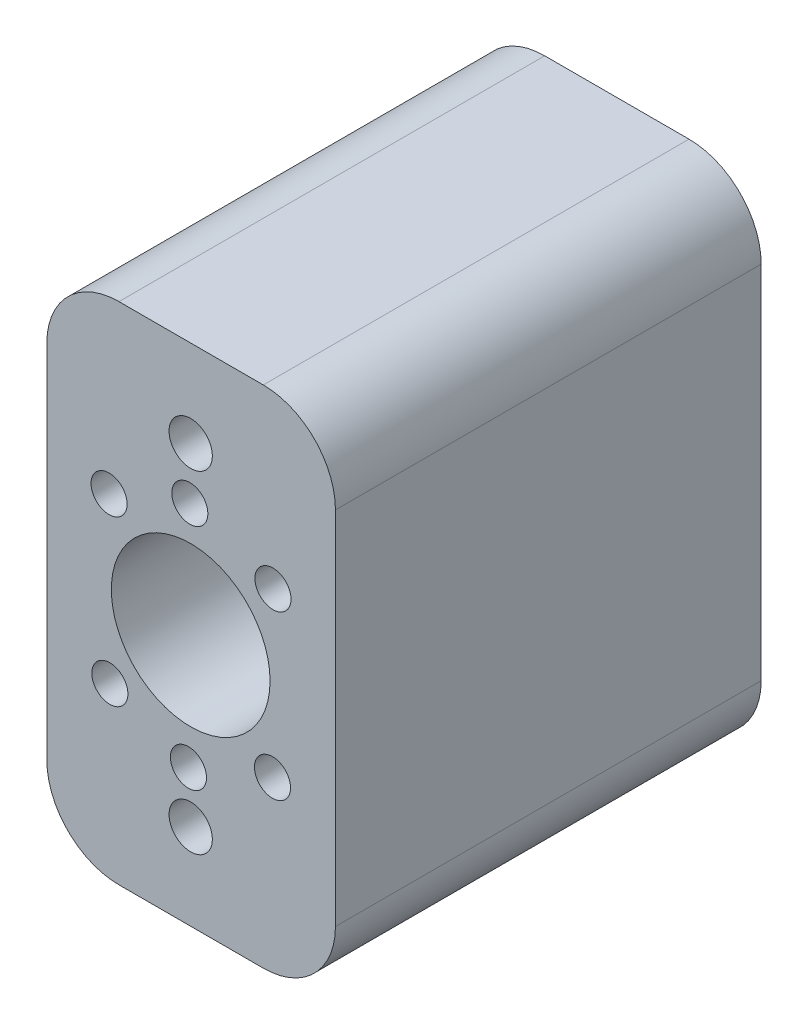
ISO-10303-21;
HEADER;
FILE_DESCRIPTION(('STEP AP214'),'2;1');
FILE_NAME('part.step','',(''),(''),'','','');
FILE_SCHEMA(('AUTOMOTIVE_DESIGN { 1 0 10303 214 1 1 1 1 }'));
ENDSEC;
DATA;
#1=APPLICATION_CONTEXT('core data for automotive mechanical design processes');
#2=APPLICATION_PROTOCOL_DEFINITION('international standard','automotive_design',2000,#1);
#3=PRODUCT_CONTEXT('',#1,'mechanical');
#4=PRODUCT('Part','Part','',(#3));
#5=PRODUCT_RELATED_PRODUCT_CATEGORY('part','',(#4));
#6=PRODUCT_DEFINITION_FORMATION('','',#4);
#7=PRODUCT_DEFINITION_CONTEXT('part definition',#1,'design');
#8=PRODUCT_DEFINITION('design','',#6,#7);
#9=PRODUCT_DEFINITION_SHAPE('','',#8);
#10=(LENGTH_UNIT() NAMED_UNIT(*) SI_UNIT(.MILLI.,.METRE.));
#11=(NAMED_UNIT(*) PLANE_ANGLE_UNIT() SI_UNIT($,.RADIAN.));
#12=(NAMED_UNIT(*) SI_UNIT($,.STERADIAN.) SOLID_ANGLE_UNIT());
#13=UNCERTAINTY_MEASURE_WITH_UNIT(LENGTH_MEASURE(1.E-05),#10,'distance_accuracy_value','');
#14=(GEOMETRIC_REPRESENTATION_CONTEXT(3) GLOBAL_UNCERTAINTY_ASSIGNED_CONTEXT((#13)) GLOBAL_UNIT_ASSIGNED_CONTEXT((#10,
#11,#12)) REPRESENTATION_CONTEXT('',''));
#15=CARTESIAN_POINT('',(0.,0.,0.));
#16=DIRECTION('',(0.,0.,1.));
#17=DIRECTION('',(1.,0.,0.));
#18=AXIS2_PLACEMENT_3D('',#15,#16,#17);
#19=CARTESIAN_POINT('',(-9.93916934376417,-24.937205351954,59.));
#20=DIRECTION('',(0.,0.,1.));
#21=DIRECTION('',(1.,0.,0.));
#22=AXIS2_PLACEMENT_3D('',#19,#20,#21);
#23=CYLINDRICAL_SURFACE('',#22,10.);
#24=DIRECTION('',(0.,0.,1.));
#25=VECTOR('',#24,1.);
#26=CARTESIAN_POINT('',(-19.9391693437642,-24.937205351954,59.));
#27=LINE('',#26,#25);
#28=CARTESIAN_POINT('',(-19.9391693437642,-24.937205351954,0.));
#29=VERTEX_POINT('',#28);
#30=CARTESIAN_POINT('',(-19.9391693437642,-24.937205351954,59.));
#31=VERTEX_POINT('',#30);
#32=EDGE_CURVE('E303',#29,#31,#27,.T.);
#33=ORIENTED_EDGE('',*,*,#32,.F.);
#34=CARTESIAN_POINT('',(-9.93916934376417,-24.937205351954,0.));
#35=DIRECTION('',(0.,0.,1.));
#36=DIRECTION('',(1.,0.,0.));
#37=AXIS2_PLACEMENT_3D('',#34,#35,#36);
#38=CIRCLE('',#37,10.);
#39=CARTESIAN_POINT('',(-9.93916934376417,-34.937205351954,0.));
#40=VERTEX_POINT('',#39);
#41=EDGE_CURVE('E51',#40,#29,#38,.F.);
#42=ORIENTED_EDGE('',*,*,#41,.F.);
#43=DIRECTION('',(0.,0.,1.));
#44=VECTOR('',#43,1.);
#45=CARTESIAN_POINT('',(-9.93916934376417,-34.937205351954,59.));
#46=LINE('',#45,#44);
#47=CARTESIAN_POINT('',(-9.93916934376417,-34.937205351954,59.));
#48=VERTEX_POINT('',#47);
#49=EDGE_CURVE('E306',#48,#40,#46,.F.);
#50=ORIENTED_EDGE('',*,*,#49,.F.);
#51=CARTESIAN_POINT('',(-9.93916934376417,-24.937205351954,59.));
#52=DIRECTION('',(0.,0.,1.));
#53=DIRECTION('',(1.,0.,0.));
#54=AXIS2_PLACEMENT_3D('',#51,#52,#53);
#55=CIRCLE('',#54,10.);
#56=EDGE_CURVE('E11',#31,#48,#55,.T.);
#57=ORIENTED_EDGE('',*,*,#56,.F.);
#58=EDGE_LOOP('',(#33,#42,#50,#57));
#59=FACE_BOUND('',#58,.T.);
#60=ADVANCED_FACE('F44',(#59),#23,.T.);
#61=CARTESIAN_POINT('',(10.0608306562358,-24.937205351954,59.));
#62=DIRECTION('',(0.,0.,1.));
#63=DIRECTION('',(1.,0.,0.));
#64=AXIS2_PLACEMENT_3D('',#61,#62,#63);
#65=CYLINDRICAL_SURFACE('',#64,10.);
#66=DIRECTION('',(0.,0.,-1.));
#67=VECTOR('',#66,1.);
#68=CARTESIAN_POINT('',(20.0608306562358,-24.937205351954,59.));
#69=LINE('',#68,#67);
#70=CARTESIAN_POINT('',(20.0608306562358,-24.937205351954,59.));
#71=VERTEX_POINT('',#70);
#72=CARTESIAN_POINT('',(20.0608306562358,-24.937205351954,0.));
#73=VERTEX_POINT('',#72);
#74=EDGE_CURVE('E292',#71,#73,#69,.T.);
#75=ORIENTED_EDGE('',*,*,#74,.F.);
#76=CARTESIAN_POINT('',(10.0608306562358,-24.937205351954,59.));
#77=DIRECTION('',(0.,0.,1.));
#78=DIRECTION('',(1.,0.,0.));
#79=AXIS2_PLACEMENT_3D('',#76,#77,#78);
#80=CIRCLE('',#79,10.);
#81=CARTESIAN_POINT('',(10.0608306562358,-34.937205351954,59.));
#82=VERTEX_POINT('',#81);
#83=EDGE_CURVE('E298',#82,#71,#80,.T.);
#84=ORIENTED_EDGE('',*,*,#83,.F.);
#85=DIRECTION('',(0.,0.,-1.));
#86=VECTOR('',#85,1.);
#87=CARTESIAN_POINT('',(10.0608306562358,-34.937205351954,59.));
#88=LINE('',#87,#86);
#89=CARTESIAN_POINT('',(10.0608306562358,-34.937205351954,0.));
#90=VERTEX_POINT('',#89);
#91=EDGE_CURVE('E295',#90,#82,#88,.F.);
#92=ORIENTED_EDGE('',*,*,#91,.F.);
#93=CARTESIAN_POINT('',(10.0608306562358,-24.937205351954,0.));
#94=DIRECTION('',(0.,0.,1.));
#95=DIRECTION('',(1.,0.,0.));
#96=AXIS2_PLACEMENT_3D('',#93,#94,#95);
#97=CIRCLE('',#96,10.);
#98=EDGE_CURVE('E300',#73,#90,#97,.F.);
#99=ORIENTED_EDGE('',*,*,#98,.F.);
#100=EDGE_LOOP('',(#75,#84,#92,#99));
#101=FACE_BOUND('',#100,.T.);
#102=ADVANCED_FACE('F336',(#101),#65,.T.);
#103=CARTESIAN_POINT('',(-9.93916934376417,25.062794648046,59.));
#104=DIRECTION('',(0.,0.,1.));
#105=DIRECTION('',(1.,0.,0.));
#106=AXIS2_PLACEMENT_3D('',#103,#104,#105);
#107=CYLINDRICAL_SURFACE('',#106,10.);
#108=DIRECTION('',(0.,0.,-1.));
#109=VECTOR('',#108,1.);
#110=CARTESIAN_POINT('',(-19.9391693437642,25.062794648046,59.));
#111=LINE('',#110,#109);
#112=CARTESIAN_POINT('',(-19.9391693437642,25.0627946480461,59.));
#113=VERTEX_POINT('',#112);
#114=CARTESIAN_POINT('',(-19.9391693437642,25.0627946480461,0.));
#115=VERTEX_POINT('',#114);
#116=EDGE_CURVE('E282',#113,#115,#111,.T.);
#117=ORIENTED_EDGE('',*,*,#116,.F.);
#118=CARTESIAN_POINT('',(-9.93916934376417,25.062794648046,59.));
#119=DIRECTION('',(0.,0.,1.));
#120=DIRECTION('',(1.,0.,0.));
#121=AXIS2_PLACEMENT_3D('',#118,#119,#120);
#122=CIRCLE('',#121,10.);
#123=CARTESIAN_POINT('',(-9.93916934376417,35.0627946480461,59.));
#124=VERTEX_POINT('',#123);
#125=EDGE_CURVE('E288',#124,#113,#122,.T.);
#126=ORIENTED_EDGE('',*,*,#125,.F.);
#127=DIRECTION('',(0.,0.,-1.));
#128=VECTOR('',#127,1.);
#129=CARTESIAN_POINT('',(-9.93916934376417,35.0627946480461,59.));
#130=LINE('',#129,#128);
#131=CARTESIAN_POINT('',(-9.93916934376417,35.0627946480461,0.));
#132=VERTEX_POINT('',#131);
#133=EDGE_CURVE('E285',#132,#124,#130,.F.);
#134=ORIENTED_EDGE('',*,*,#133,.F.);
#135=CARTESIAN_POINT('',(-9.93916934376417,25.062794648046,0.));
#136=DIRECTION('',(0.,0.,1.));
#137=DIRECTION('',(1.,0.,0.));
#138=AXIS2_PLACEMENT_3D('',#135,#136,#137);
#139=CIRCLE('',#138,10.);
#140=EDGE_CURVE('E290',#115,#132,#139,.F.);
#141=ORIENTED_EDGE('',*,*,#140,.F.);
#142=EDGE_LOOP('',(#117,#126,#134,#141));
#143=FACE_BOUND('',#142,.T.);
#144=ADVANCED_FACE('F316',(#143),#107,.T.);
#145=CARTESIAN_POINT('',(10.0608306562358,25.062794648046,59.));
#146=DIRECTION('',(0.,0.,1.));
#147=DIRECTION('',(1.,0.,0.));
#148=AXIS2_PLACEMENT_3D('',#145,#146,#147);
#149=CYLINDRICAL_SURFACE('',#148,10.);
#150=DIRECTION('',(0.,0.,1.));
#151=VECTOR('',#150,1.);
#152=CARTESIAN_POINT('',(20.0608306562358,25.062794648046,59.));
#153=LINE('',#152,#151);
#154=CARTESIAN_POINT('',(20.0608306562358,25.0627946480461,0.));
#155=VERTEX_POINT('',#154);
#156=CARTESIAN_POINT('',(20.0608306562358,25.0627946480461,59.));
#157=VERTEX_POINT('',#156);
#158=EDGE_CURVE('E263',#155,#157,#153,.T.);
#159=ORIENTED_EDGE('',*,*,#158,.F.);
#160=CARTESIAN_POINT('',(10.0608306562358,25.062794648046,0.));
#161=DIRECTION('',(0.,0.,1.));
#162=DIRECTION('',(1.,0.,0.));
#163=AXIS2_PLACEMENT_3D('',#160,#161,#162);
#164=CIRCLE('',#163,10.);
#165=CARTESIAN_POINT('',(10.0608306562358,35.0627946480461,0.));
#166=VERTEX_POINT('',#165);
#167=EDGE_CURVE('E277',#166,#155,#164,.F.);
#168=ORIENTED_EDGE('',*,*,#167,.F.);
#169=DIRECTION('',(0.,0.,1.));
#170=VECTOR('',#169,1.);
#171=CARTESIAN_POINT('',(10.0608306562358,35.0627946480461,59.));
#172=LINE('',#171,#170);
#173=CARTESIAN_POINT('',(10.0608306562358,35.0627946480461,59.));
#174=VERTEX_POINT('',#173);
#175=EDGE_CURVE('E274',#174,#166,#172,.F.);
#176=ORIENTED_EDGE('',*,*,#175,.F.);
#177=CARTESIAN_POINT('',(10.0608306562358,25.062794648046,59.));
#178=DIRECTION('',(0.,0.,1.));
#179=DIRECTION('',(1.,0.,0.));
#180=AXIS2_PLACEMENT_3D('',#177,#178,#179);
#181=CIRCLE('',#180,10.);
#182=EDGE_CURVE('E279',#157,#174,#181,.T.);
#183=ORIENTED_EDGE('',*,*,#182,.F.);
#184=EDGE_LOOP('',(#159,#168,#176,#183));
#185=FACE_BOUND('',#184,.T.);
#186=ADVANCED_FACE('F324',(#185),#149,.T.);
#187=CARTESIAN_POINT('',(-19.9391693437642,35.0627946480461,59.));
#188=DIRECTION('',(1.,0.,0.));
#189=DIRECTION('',(0.,0.,-1.));
#190=AXIS2_PLACEMENT_3D('',#187,#188,#189);
#191=PLANE('',#190);
#192=DIRECTION('',(0.,0.,1.));
#193=VECTOR('',#192,1.);
#194=CARTESIAN_POINT('',(-19.9391693437642,-17.9372053519539,17.5));
#195=LINE('',#194,#193);
#196=CARTESIAN_POINT('',(-19.9391693437642,-17.9372053519539,17.5));
#197=VERTEX_POINT('',#196);
#198=CARTESIAN_POINT('',(-19.9391693437642,-17.9372053519539,41.5));
#199=VERTEX_POINT('',#198);
#200=EDGE_CURVE('E176',#197,#199,#195,.T.);
#201=ORIENTED_EDGE('',*,*,#200,.F.);
#202=DIRECTION('',(0.,-1.,0.));
#203=VECTOR('',#202,1.);
#204=CARTESIAN_POINT('',(-19.9391693437642,-11.9372053519539,17.5));
#205=LINE('',#204,#203);
#206=CARTESIAN_POINT('',(-19.9391693437642,-11.9372053519539,17.5));
#207=VERTEX_POINT('',#206);
#208=EDGE_CURVE('E147',#207,#197,#205,.T.);
#209=ORIENTED_EDGE('',*,*,#208,.F.);
#210=DIRECTION('',(0.,0.,1.));
#211=VECTOR('',#210,1.);
#212=CARTESIAN_POINT('',(-19.9391693437642,-11.9372053519539,17.5));
#213=LINE('',#212,#211);
#214=CARTESIAN_POINT('',(-19.9391693437642,-11.9372053519539,41.5));
#215=VERTEX_POINT('',#214);
#216=EDGE_CURVE('E164',#207,#215,#213,.T.);
#217=ORIENTED_EDGE('',*,*,#216,.T.);
#218=DIRECTION('',(0.,-1.,0.));
#219=VECTOR('',#218,1.);
#220=CARTESIAN_POINT('',(-19.9391693437642,-11.9372053519539,41.5));
#221=LINE('',#220,#219);
#222=EDGE_CURVE('E167',#215,#199,#221,.T.);
#223=ORIENTED_EDGE('',*,*,#222,.T.);
#224=EDGE_LOOP('',(#201,#209,#217,#223));
#225=FACE_BOUND('',#224,.T.);
#226=CARTESIAN_POINT('',(-19.9391693437642,15.0627946480461,14.5));
#227=DIRECTION('',(-1.,0.,0.));
#228=DIRECTION('',(0.,0.,1.));
#229=AXIS2_PLACEMENT_3D('',#226,#227,#228);
#230=CIRCLE('',#229,1.25);
#231=CARTESIAN_POINT('',(-19.9391693437642,15.0627946480461,15.75));
#232=VERTEX_POINT('',#231);
#233=EDGE_CURVE('E183',#232,#232,#230,.T.);
#234=ORIENTED_EDGE('',*,*,#233,.F.);
#235=EDGE_LOOP('',(#234));
#236=FACE_BOUND('',#235,.T.);
#237=CARTESIAN_POINT('',(-19.9391693437642,15.0627946480461,44.5));
#238=DIRECTION('',(-1.,0.,0.));
#239=DIRECTION('',(0.,0.,1.));
#240=AXIS2_PLACEMENT_3D('',#237,#238,#239);
#241=CIRCLE('',#240,1.25);
#242=CARTESIAN_POINT('',(-19.9391693437642,15.0627946480461,45.75));
#243=VERTEX_POINT('',#242);
#244=EDGE_CURVE('E192',#243,#243,#241,.T.);
#245=ORIENTED_EDGE('',*,*,#244,.F.);
#246=EDGE_LOOP('',(#245));
#247=FACE_BOUND('',#246,.T.);
#248=CARTESIAN_POINT('',(-19.9391693437642,-14.9372053519539,44.5));
#249=DIRECTION('',(-1.,0.,0.));
#250=DIRECTION('',(0.,0.,1.));
#251=AXIS2_PLACEMENT_3D('',#248,#249,#250);
#252=CIRCLE('',#251,1.25);
#253=CARTESIAN_POINT('',(-19.9391693437642,-14.9372053519539,45.75));
#254=VERTEX_POINT('',#253);
#255=EDGE_CURVE('E198',#254,#254,#252,.T.);
#256=ORIENTED_EDGE('',*,*,#255,.F.);
#257=EDGE_LOOP('',(#256));
#258=FACE_BOUND('',#257,.T.);
#259=CARTESIAN_POINT('',(-19.9391693437642,-14.9372053519539,14.5));
#260=DIRECTION('',(-1.,0.,0.));
#261=DIRECTION('',(0.,0.,1.));
#262=AXIS2_PLACEMENT_3D('',#259,#260,#261);
#263=CIRCLE('',#262,1.25);
#264=CARTESIAN_POINT('',(-19.9391693437642,-14.9372053519539,15.75));
#265=VERTEX_POINT('',#264);
#266=EDGE_CURVE('E204',#265,#265,#263,.T.);
#267=ORIENTED_EDGE('',*,*,#266,.F.);
#268=EDGE_LOOP('',(#267));
#269=FACE_BOUND('',#268,.T.);
#270=DIRECTION('',(0.,-1.,0.));
#271=VECTOR('',#270,1.);
#272=CARTESIAN_POINT('',(-19.9391693437642,35.0627946480461,0.));
#273=LINE('',#272,#271);
#274=EDGE_CURVE('E250',#115,#29,#273,.T.);
#275=ORIENTED_EDGE('',*,*,#274,.T.);
#276=ORIENTED_EDGE('',*,*,#32,.T.);
#277=DIRECTION('',(0.,-1.,0.));
#278=VECTOR('',#277,1.);
#279=CARTESIAN_POINT('',(-19.9391693437642,35.0627946480461,59.));
#280=LINE('',#279,#278);
#281=EDGE_CURVE('E253',#113,#31,#280,.T.);
#282=ORIENTED_EDGE('',*,*,#281,.F.);
#283=ORIENTED_EDGE('',*,*,#116,.T.);
#284=EDGE_LOOP('',(#275,#276,#282,#283));
#285=FACE_BOUND('',#284,.T.);
#286=ADVANCED_FACE('F313',(#225,#236,#247,#258,#269,#285),#191,.F.);
#287=CARTESIAN_POINT('',(-19.9391693437642,-34.937205351954,59.));
#288=DIRECTION('',(0.,1.,0.));
#289=DIRECTION('',(0.,0.,1.));
#290=AXIS2_PLACEMENT_3D('',#287,#288,#289);
#291=PLANE('',#290);
#292=DIRECTION('',(1.,0.,0.));
#293=VECTOR('',#292,1.);
#294=CARTESIAN_POINT('',(-19.9391693437642,-34.937205351954,59.));
#295=LINE('',#294,#293);
#296=EDGE_CURVE('E255',#48,#82,#295,.T.);
#297=ORIENTED_EDGE('',*,*,#296,.F.);
#298=ORIENTED_EDGE('',*,*,#49,.T.);
#299=DIRECTION('',(1.,0.,0.));
#300=VECTOR('',#299,1.);
#301=CARTESIAN_POINT('',(-19.9391693437642,-34.937205351954,0.));
#302=LINE('',#301,#300);
#303=EDGE_CURVE('E266',#40,#90,#302,.T.);
#304=ORIENTED_EDGE('',*,*,#303,.T.);
#305=ORIENTED_EDGE('',*,*,#91,.T.);
#306=EDGE_LOOP('',(#297,#298,#304,#305));
#307=FACE_BOUND('',#306,.T.);
#308=ADVANCED_FACE('F339',(#307),#291,.F.);
#309=CARTESIAN_POINT('',(20.0608306562358,35.0627946480461,59.));
#310=DIRECTION('',(1.,0.,0.));
#311=DIRECTION('',(0.,0.,-1.));
#312=AXIS2_PLACEMENT_3D('',#309,#310,#311);
#313=PLANE('',#312);
#314=DIRECTION('',(0.,-1.,0.));
#315=VECTOR('',#314,1.);
#316=CARTESIAN_POINT('',(20.0608306562358,35.0627946480461,59.));
#317=LINE('',#316,#315);
#318=EDGE_CURVE('E258',#157,#71,#317,.T.);
#319=ORIENTED_EDGE('',*,*,#318,.T.);
#320=ORIENTED_EDGE('',*,*,#74,.T.);
#321=DIRECTION('',(0.,-1.,0.));
#322=VECTOR('',#321,1.);
#323=CARTESIAN_POINT('',(20.0608306562358,35.0627946480461,0.));
#324=LINE('',#323,#322);
#325=EDGE_CURVE('E268',#155,#73,#324,.T.);
#326=ORIENTED_EDGE('',*,*,#325,.F.);
#327=ORIENTED_EDGE('',*,*,#158,.T.);
#328=EDGE_LOOP('',(#319,#320,#326,#327));
#329=FACE_BOUND('',#328,.T.);
#330=ADVANCED_FACE('F331',(#329),#313,.T.);
#331=CARTESIAN_POINT('',(-19.9391693437642,35.0627946480461,59.));
#332=DIRECTION('',(0.,1.,0.));
#333=DIRECTION('',(0.,0.,1.));
#334=AXIS2_PLACEMENT_3D('',#331,#332,#333);
#335=PLANE('',#334);
#336=DIRECTION('',(1.,0.,0.));
#337=VECTOR('',#336,1.);
#338=CARTESIAN_POINT('',(-19.9391693437642,35.0627946480461,0.));
#339=LINE('',#338,#337);
#340=EDGE_CURVE('E256',#132,#166,#339,.T.);
#341=ORIENTED_EDGE('',*,*,#340,.F.);
#342=ORIENTED_EDGE('',*,*,#133,.T.);
#343=DIRECTION('',(1.,0.,0.));
#344=VECTOR('',#343,1.);
#345=CARTESIAN_POINT('',(-19.9391693437642,35.0627946480461,59.));
#346=LINE('',#345,#344);
#347=EDGE_CURVE('E261',#124,#174,#346,.T.);
#348=ORIENTED_EDGE('',*,*,#347,.T.);
#349=ORIENTED_EDGE('',*,*,#175,.T.);
#350=EDGE_LOOP('',(#341,#342,#348,#349));
#351=FACE_BOUND('',#350,.T.);
#352=ADVANCED_FACE('F326',(#351),#335,.T.);
#353=CARTESIAN_POINT('',(0.,0.,59.));
#354=DIRECTION('',(0.,0.,1.));
#355=DIRECTION('',(1.,0.,0.));
#356=AXIS2_PLACEMENT_3D('',#353,#354,#355);
#357=PLANE('',#356);
#358=CARTESIAN_POINT('',(0.,23.01,59.));
#359=DIRECTION('',(0.,0.,1.));
#360=DIRECTION('',(1.,0.,0.));
#361=AXIS2_PLACEMENT_3D('',#358,#359,#360);
#362=CIRCLE('',#361,3.);
#363=CARTESIAN_POINT('',(3.,23.01,59.));
#364=VERTEX_POINT('',#363);
#365=EDGE_CURVE('E762',#364,#364,#362,.T.);
#366=ORIENTED_EDGE('',*,*,#365,.F.);
#367=EDGE_LOOP('',(#366));
#368=FACE_BOUND('',#367,.T.);
#369=CARTESIAN_POINT('',(0.,-23.01,59.));
#370=DIRECTION('',(0.,0.,1.));
#371=DIRECTION('',(1.,0.,0.));
#372=AXIS2_PLACEMENT_3D('',#369,#370,#371);
#373=CIRCLE('',#372,3.);
#374=CARTESIAN_POINT('',(3.,-23.01,59.));
#375=VERTEX_POINT('',#374);
#376=EDGE_CURVE('E763',#375,#375,#373,.T.);
#377=ORIENTED_EDGE('',*,*,#376,.F.);
#378=EDGE_LOOP('',(#377));
#379=FACE_BOUND('',#378,.T.);
#380=CARTESIAN_POINT('',(-11.3137084989847,11.3137084989848,59.));
#381=DIRECTION('',(0.,0.,1.));
#382=DIRECTION('',(1.,0.,0.));
#383=AXIS2_PLACEMENT_3D('',#380,#381,#382);
#384=CIRCLE('',#383,2.5);
#385=CARTESIAN_POINT('',(-8.8137084989847,11.3137084989848,59.));
#386=VERTEX_POINT('',#385);
#387=EDGE_CURVE('E227',#386,#386,#384,.T.);
#388=ORIENTED_EDGE('',*,*,#387,.F.);
#389=EDGE_LOOP('',(#388));
#390=FACE_BOUND('',#389,.T.);
#391=CARTESIAN_POINT('',(-0.122338903727766,15.7597255865445,59.));
#392=DIRECTION('',(0.,0.,1.));
#393=DIRECTION('',(1.,0.,0.));
#394=AXIS2_PLACEMENT_3D('',#391,#392,#393);
#395=CIRCLE('',#394,2.5);
#396=CARTESIAN_POINT('',(2.37766109627223,15.7597255865445,59.));
#397=VERTEX_POINT('',#396);
#398=EDGE_CURVE('E233',#397,#397,#395,.T.);
#399=ORIENTED_EDGE('',*,*,#398,.F.);
#400=EDGE_LOOP('',(#399));
#401=FACE_BOUND('',#400,.T.);
#402=CARTESIAN_POINT('',(11.4026934424135,11.2636964844784,59.));
#403=DIRECTION('',(0.,0.,1.));
#404=DIRECTION('',(1.,0.,0.));
#405=AXIS2_PLACEMENT_3D('',#402,#403,#404);
#406=CIRCLE('',#405,2.5);
#407=CARTESIAN_POINT('',(13.9026934424135,11.2636964844784,59.));
#408=VERTEX_POINT('',#407);
#409=EDGE_CURVE('E239',#408,#408,#406,.T.);
#410=ORIENTED_EDGE('',*,*,#409,.F.);
#411=EDGE_LOOP('',(#410));
#412=FACE_BOUND('',#411,.T.);
#413=CARTESIAN_POINT('',(11.3393690888633,-11.4064220865028,59.));
#414=DIRECTION('',(0.,0.,1.));
#415=DIRECTION('',(1.,0.,0.));
#416=AXIS2_PLACEMENT_3D('',#413,#414,#415);
#417=CIRCLE('',#416,2.5);
#418=CARTESIAN_POINT('',(13.8393690888633,-11.4064220865028,59.));
#419=VERTEX_POINT('',#418);
#420=EDGE_CURVE('E214',#419,#419,#417,.T.);
#421=ORIENTED_EDGE('',*,*,#420,.F.);
#422=EDGE_LOOP('',(#421));
#423=FACE_BOUND('',#422,.T.);
#424=CARTESIAN_POINT('',(-0.312311964378448,-16.0290998956694,59.));
#425=DIRECTION('',(0.,0.,1.));
#426=DIRECTION('',(1.,0.,0.));
#427=AXIS2_PLACEMENT_3D('',#424,#425,#426);
#428=CIRCLE('',#427,2.5);
#429=CARTESIAN_POINT('',(2.18768803562155,-16.0290998956694,59.));
#430=VERTEX_POINT('',#429);
#431=EDGE_CURVE('E215',#430,#430,#428,.T.);
#432=ORIENTED_EDGE('',*,*,#431,.F.);
#433=EDGE_LOOP('',(#432));
#434=FACE_BOUND('',#433,.T.);
#435=CARTESIAN_POINT('',(-11.2041007750175,-11.4064220865028,59.));
#436=DIRECTION('',(0.,0.,1.));
#437=DIRECTION('',(1.,0.,0.));
#438=AXIS2_PLACEMENT_3D('',#435,#436,#437);
#439=CIRCLE('',#438,2.5);
#440=CARTESIAN_POINT('',(-8.70410077501747,-11.4064220865028,59.));
#441=VERTEX_POINT('',#440);
#442=EDGE_CURVE('E210',#441,#441,#439,.T.);
#443=ORIENTED_EDGE('',*,*,#442,.F.);
#444=EDGE_LOOP('',(#443));
#445=FACE_BOUND('',#444,.T.);
#446=CARTESIAN_POINT('',(0.,0.,59.));
#447=DIRECTION('',(0.,0.,1.));
#448=DIRECTION('',(1.,0.,0.));
#449=AXIS2_PLACEMENT_3D('',#446,#447,#448);
#450=CIRCLE('',#449,11.);
#451=CARTESIAN_POINT('',(11.,0.,59.));
#452=VERTEX_POINT('',#451);
#453=EDGE_CURVE('E247',#452,#452,#450,.T.);
#454=ORIENTED_EDGE('',*,*,#453,.F.);
#455=EDGE_LOOP('',(#454));
#456=FACE_BOUND('',#455,.T.);
#457=ORIENTED_EDGE('',*,*,#281,.T.);
#458=ORIENTED_EDGE('',*,*,#56,.T.);
#459=ORIENTED_EDGE('',*,*,#296,.T.);
#460=ORIENTED_EDGE('',*,*,#83,.T.);
#461=ORIENTED_EDGE('',*,*,#318,.F.);
#462=ORIENTED_EDGE('',*,*,#182,.T.);
#463=ORIENTED_EDGE('',*,*,#347,.F.);
#464=ORIENTED_EDGE('',*,*,#125,.T.);
#465=EDGE_LOOP('',(#457,#458,#459,#460,#461,#462,#463,#464));
#466=FACE_BOUND('',#465,.T.);
#467=ADVANCED_FACE('F329',(#368,#379,#390,#401,#412,#423,#434,#445,#456,#466),#357,.T.);
#468=CARTESIAN_POINT('',(0.,0.,0.));
#469=DIRECTION('',(0.,0.,1.));
#470=DIRECTION('',(1.,0.,0.));
#471=AXIS2_PLACEMENT_3D('',#468,#469,#470);
#472=PLANE('',#471);
#473=CARTESIAN_POINT('',(0.,23.01,0.));
#474=DIRECTION('',(0.,0.,1.));
#475=DIRECTION('',(1.,0.,0.));
#476=AXIS2_PLACEMENT_3D('',#473,#474,#475);
#477=CIRCLE('',#476,3.);
#478=CARTESIAN_POINT('',(3.,23.01,0.));
#479=VERTEX_POINT('',#478);
#480=EDGE_CURVE('E177',#479,#479,#477,.T.);
#481=ORIENTED_EDGE('',*,*,#480,.T.);
#482=EDGE_LOOP('',(#481));
#483=FACE_BOUND('',#482,.T.);
#484=CARTESIAN_POINT('',(0.,-23.01,0.));
#485=DIRECTION('',(0.,0.,1.));
#486=DIRECTION('',(1.,0.,0.));
#487=AXIS2_PLACEMENT_3D('',#484,#485,#486);
#488=CIRCLE('',#487,3.);
#489=CARTESIAN_POINT('',(3.,-23.01,0.));
#490=VERTEX_POINT('',#489);
#491=EDGE_CURVE('E170',#490,#490,#488,.T.);
#492=ORIENTED_EDGE('',*,*,#491,.T.);
#493=EDGE_LOOP('',(#492));
#494=FACE_BOUND('',#493,.T.);
#495=CARTESIAN_POINT('',(-11.3137084989847,11.3137084989848,0.));
#496=DIRECTION('',(0.,0.,1.));
#497=DIRECTION('',(1.,0.,0.));
#498=AXIS2_PLACEMENT_3D('',#495,#496,#497);
#499=CIRCLE('',#498,2.5);
#500=CARTESIAN_POINT('',(-8.8137084989847,11.3137084989848,0.));
#501=VERTEX_POINT('',#500);
#502=EDGE_CURVE('E223',#501,#501,#499,.T.);
#503=ORIENTED_EDGE('',*,*,#502,.T.);
#504=EDGE_LOOP('',(#503));
#505=FACE_BOUND('',#504,.T.);
#506=CARTESIAN_POINT('',(-0.122338903727766,15.7597255865445,0.));
#507=DIRECTION('',(0.,0.,1.));
#508=DIRECTION('',(1.,0.,0.));
#509=AXIS2_PLACEMENT_3D('',#506,#507,#508);
#510=CIRCLE('',#509,2.5);
#511=CARTESIAN_POINT('',(2.37766109627223,15.7597255865445,0.));
#512=VERTEX_POINT('',#511);
#513=EDGE_CURVE('E230',#512,#512,#510,.T.);
#514=ORIENTED_EDGE('',*,*,#513,.T.);
#515=EDGE_LOOP('',(#514));
#516=FACE_BOUND('',#515,.T.);
#517=CARTESIAN_POINT('',(11.4026934424135,11.2636964844784,0.));
#518=DIRECTION('',(0.,0.,1.));
#519=DIRECTION('',(1.,0.,0.));
#520=AXIS2_PLACEMENT_3D('',#517,#518,#519);
#521=CIRCLE('',#520,2.5);
#522=CARTESIAN_POINT('',(13.9026934424135,11.2636964844784,0.));
#523=VERTEX_POINT('',#522);
#524=EDGE_CURVE('E236',#523,#523,#521,.T.);
#525=ORIENTED_EDGE('',*,*,#524,.T.);
#526=EDGE_LOOP('',(#525));
#527=FACE_BOUND('',#526,.T.);
#528=CARTESIAN_POINT('',(11.3393690888633,-11.4064220865028,0.));
#529=DIRECTION('',(0.,0.,1.));
#530=DIRECTION('',(1.,0.,0.));
#531=AXIS2_PLACEMENT_3D('',#528,#529,#530);
#532=CIRCLE('',#531,2.5);
#533=CARTESIAN_POINT('',(13.8393690888633,-11.4064220865028,0.));
#534=VERTEX_POINT('',#533);
#535=EDGE_CURVE('E242',#534,#534,#532,.T.);
#536=ORIENTED_EDGE('',*,*,#535,.T.);
#537=EDGE_LOOP('',(#536));
#538=FACE_BOUND('',#537,.T.);
#539=CARTESIAN_POINT('',(-0.312311964378448,-16.0290998956694,0.));
#540=DIRECTION('',(0.,0.,1.));
#541=DIRECTION('',(1.,0.,0.));
#542=AXIS2_PLACEMENT_3D('',#539,#540,#541);
#543=CIRCLE('',#542,2.5);
#544=CARTESIAN_POINT('',(2.18768803562155,-16.0290998956694,0.));
#545=VERTEX_POINT('',#544);
#546=EDGE_CURVE('E211',#545,#545,#543,.T.);
#547=ORIENTED_EDGE('',*,*,#546,.T.);
#548=EDGE_LOOP('',(#547));
#549=FACE_BOUND('',#548,.T.);
#550=CARTESIAN_POINT('',(-11.2041007750175,-11.4064220865028,0.));
#551=DIRECTION('',(0.,0.,1.));
#552=DIRECTION('',(1.,0.,0.));
#553=AXIS2_PLACEMENT_3D('',#550,#551,#552);
#554=CIRCLE('',#553,2.5);
#555=CARTESIAN_POINT('',(-8.70410077501747,-11.4064220865028,0.));
#556=VERTEX_POINT('',#555);
#557=EDGE_CURVE('E218',#556,#556,#554,.T.);
#558=ORIENTED_EDGE('',*,*,#557,.T.);
#559=EDGE_LOOP('',(#558));
#560=FACE_BOUND('',#559,.T.);
#561=CARTESIAN_POINT('',(0.,0.,0.));
#562=DIRECTION('',(0.,0.,1.));
#563=DIRECTION('',(1.,0.,0.));
#564=AXIS2_PLACEMENT_3D('',#561,#562,#563);
#565=CIRCLE('',#564,11.);
#566=CARTESIAN_POINT('',(11.,0.,0.));
#567=VERTEX_POINT('',#566);
#568=EDGE_CURVE('E226',#567,#567,#565,.T.);
#569=ORIENTED_EDGE('',*,*,#568,.T.);
#570=EDGE_LOOP('',(#569));
#571=FACE_BOUND('',#570,.T.);
#572=ORIENTED_EDGE('',*,*,#303,.F.);
#573=ORIENTED_EDGE('',*,*,#41,.T.);
#574=ORIENTED_EDGE('',*,*,#274,.F.);
#575=ORIENTED_EDGE('',*,*,#140,.T.);
#576=ORIENTED_EDGE('',*,*,#340,.T.);
#577=ORIENTED_EDGE('',*,*,#167,.T.);
#578=ORIENTED_EDGE('',*,*,#325,.T.);
#579=ORIENTED_EDGE('',*,*,#98,.T.);
#580=EDGE_LOOP('',(#572,#573,#574,#575,#576,#577,#578,#579));
#581=FACE_BOUND('',#580,.T.);
#582=ADVANCED_FACE('F310',(#483,#494,#505,#516,#527,#538,#549,#560,#571,#581),#472,.F.);
#583=CARTESIAN_POINT('',(0.,0.,59.));
#584=DIRECTION('',(0.,0.,-1.));
#585=DIRECTION('',(-1.,0.,0.));
#586=AXIS2_PLACEMENT_3D('',#583,#584,#585);
#587=CYLINDRICAL_SURFACE('',#586,11.);
#588=ORIENTED_EDGE('',*,*,#453,.T.);
#589=EDGE_LOOP('',(#588));
#590=FACE_BOUND('',#589,.T.);
#591=ORIENTED_EDGE('',*,*,#568,.F.);
#592=EDGE_LOOP('',(#591));
#593=FACE_BOUND('',#592,.T.);
#594=ADVANCED_FACE('F399',(#590,#593),#587,.F.);
#595=CARTESIAN_POINT('',(-11.2041007750175,-11.4064220865028,59.));
#596=DIRECTION('',(0.,0.,-1.));
#597=DIRECTION('',(-1.,0.,0.));
#598=AXIS2_PLACEMENT_3D('',#595,#596,#597);
#599=CYLINDRICAL_SURFACE('',#598,2.5);
#600=ORIENTED_EDGE('',*,*,#442,.T.);
#601=EDGE_LOOP('',(#600));
#602=FACE_BOUND('',#601,.T.);
#603=ORIENTED_EDGE('',*,*,#557,.F.);
#604=EDGE_LOOP('',(#603));
#605=FACE_BOUND('',#604,.T.);
#606=ADVANCED_FACE('F618',(#602,#605),#599,.F.);
#607=CARTESIAN_POINT('',(-0.312311964378448,-16.0290998956694,59.));
#608=DIRECTION('',(0.,0.,-1.));
#609=DIRECTION('',(-1.,0.,0.));
#610=AXIS2_PLACEMENT_3D('',#607,#608,#609);
#611=CYLINDRICAL_SURFACE('',#610,2.5);
#612=ORIENTED_EDGE('',*,*,#431,.T.);
#613=EDGE_LOOP('',(#612));
#614=FACE_BOUND('',#613,.T.);
#615=ORIENTED_EDGE('',*,*,#546,.F.);
#616=EDGE_LOOP('',(#615));
#617=FACE_BOUND('',#616,.T.);
#618=ADVANCED_FACE('F608',(#614,#617),#611,.F.);
#619=CARTESIAN_POINT('',(11.3393690888633,-11.4064220865028,59.));
#620=DIRECTION('',(0.,0.,-1.));
#621=DIRECTION('',(-1.,0.,0.));
#622=AXIS2_PLACEMENT_3D('',#619,#620,#621);
#623=CYLINDRICAL_SURFACE('',#622,2.5);
#624=ORIENTED_EDGE('',*,*,#420,.T.);
#625=EDGE_LOOP('',(#624));
#626=FACE_BOUND('',#625,.T.);
#627=ORIENTED_EDGE('',*,*,#535,.F.);
#628=EDGE_LOOP('',(#627));
#629=FACE_BOUND('',#628,.T.);
#630=ADVANCED_FACE('F598',(#626,#629),#623,.F.);
#631=CARTESIAN_POINT('',(11.4026934424135,11.2636964844784,59.));
#632=DIRECTION('',(0.,0.,-1.));
#633=DIRECTION('',(-1.,0.,0.));
#634=AXIS2_PLACEMENT_3D('',#631,#632,#633);
#635=CYLINDRICAL_SURFACE('',#634,2.5);
#636=ORIENTED_EDGE('',*,*,#409,.T.);
#637=EDGE_LOOP('',(#636));
#638=FACE_BOUND('',#637,.T.);
#639=ORIENTED_EDGE('',*,*,#524,.F.);
#640=EDGE_LOOP('',(#639));
#641=FACE_BOUND('',#640,.T.);
#642=ADVANCED_FACE('F588',(#638,#641),#635,.F.);
#643=CARTESIAN_POINT('',(-0.122338903727766,15.7597255865445,59.));
#644=DIRECTION('',(0.,0.,-1.));
#645=DIRECTION('',(-1.,0.,0.));
#646=AXIS2_PLACEMENT_3D('',#643,#644,#645);
#647=CYLINDRICAL_SURFACE('',#646,2.5);
#648=ORIENTED_EDGE('',*,*,#398,.T.);
#649=EDGE_LOOP('',(#648));
#650=FACE_BOUND('',#649,.T.);
#651=ORIENTED_EDGE('',*,*,#513,.F.);
#652=EDGE_LOOP('',(#651));
#653=FACE_BOUND('',#652,.T.);
#654=ADVANCED_FACE('F578',(#650,#653),#647,.F.);
#655=CARTESIAN_POINT('',(-11.3137084989847,11.3137084989848,59.));
#656=DIRECTION('',(0.,0.,-1.));
#657=DIRECTION('',(-1.,0.,0.));
#658=AXIS2_PLACEMENT_3D('',#655,#656,#657);
#659=CYLINDRICAL_SURFACE('',#658,2.5);
#660=ORIENTED_EDGE('',*,*,#387,.T.);
#661=EDGE_LOOP('',(#660));
#662=FACE_BOUND('',#661,.T.);
#663=ORIENTED_EDGE('',*,*,#502,.F.);
#664=EDGE_LOOP('',(#663));
#665=FACE_BOUND('',#664,.T.);
#666=ADVANCED_FACE('F568',(#662,#665),#659,.F.);
#667=CARTESIAN_POINT('',(-12.6902451175486,-14.9372053519539,14.5));
#668=DIRECTION('',(-1.,0.,0.));
#669=DIRECTION('',(0.,0.,1.));
#670=AXIS2_PLACEMENT_3D('',#667,#668,#669);
#671=CONICAL_SURFACE('',#670,1.25,1.02974425867665);
#672=CARTESIAN_POINT('',(-11.9391693437642,-14.9372053519539,14.5));
#673=VERTEX_POINT('',#672);
#674=VERTEX_LOOP('',#673);
#675=FACE_BOUND('',#674,.T.);
#676=CARTESIAN_POINT('',(-12.6902451175486,-14.9372053519539,14.5));
#677=DIRECTION('',(-1.,0.,0.));
#678=DIRECTION('',(0.,0.,1.));
#679=AXIS2_PLACEMENT_3D('',#676,#677,#678);
#680=CIRCLE('',#679,1.25);
#681=CARTESIAN_POINT('',(-12.6902451175486,-14.9372053519539,15.75));
#682=VERTEX_POINT('',#681);
#683=EDGE_CURVE('E207',#682,#682,#680,.T.);
#684=ORIENTED_EDGE('',*,*,#683,.T.);
#685=EDGE_LOOP('',(#684));
#686=FACE_BOUND('',#685,.T.);
#687=ADVANCED_FACE('F558',(#675,#686),#671,.F.);
#688=CARTESIAN_POINT('',(-19.9391693437642,-14.9372053519539,14.5));
#689=DIRECTION('',(-1.,0.,0.));
#690=DIRECTION('',(0.,0.,1.));
#691=AXIS2_PLACEMENT_3D('',#688,#689,#690);
#692=CYLINDRICAL_SURFACE('',#691,1.25);
#693=ORIENTED_EDGE('',*,*,#683,.F.);
#694=EDGE_LOOP('',(#693));
#695=FACE_BOUND('',#694,.T.);
#696=ORIENTED_EDGE('',*,*,#266,.T.);
#697=EDGE_LOOP('',(#696));
#698=FACE_BOUND('',#697,.T.);
#699=ADVANCED_FACE('F548',(#695,#698),#692,.F.);
#700=CARTESIAN_POINT('',(-12.6902451175486,-14.9372053519539,44.5));
#701=DIRECTION('',(-1.,0.,0.));
#702=DIRECTION('',(0.,0.,1.));
#703=AXIS2_PLACEMENT_3D('',#700,#701,#702);
#704=CONICAL_SURFACE('',#703,1.25,1.02974425867665);
#705=CARTESIAN_POINT('',(-11.9391693437642,-14.9372053519539,44.5));
#706=VERTEX_POINT('',#705);
#707=VERTEX_LOOP('',#706);
#708=FACE_BOUND('',#707,.T.);
#709=CARTESIAN_POINT('',(-12.6902451175486,-14.9372053519539,44.5));
#710=DIRECTION('',(-1.,0.,0.));
#711=DIRECTION('',(0.,0.,1.));
#712=AXIS2_PLACEMENT_3D('',#709,#710,#711);
#713=CIRCLE('',#712,1.25);
#714=CARTESIAN_POINT('',(-12.6902451175486,-14.9372053519539,45.75));
#715=VERTEX_POINT('',#714);
#716=EDGE_CURVE('E201',#715,#715,#713,.T.);
#717=ORIENTED_EDGE('',*,*,#716,.T.);
#718=EDGE_LOOP('',(#717));
#719=FACE_BOUND('',#718,.T.);
#720=ADVANCED_FACE('F538',(#708,#719),#704,.F.);
#721=CARTESIAN_POINT('',(-19.9391693437642,-14.9372053519539,44.5));
#722=DIRECTION('',(-1.,0.,0.));
#723=DIRECTION('',(0.,0.,1.));
#724=AXIS2_PLACEMENT_3D('',#721,#722,#723);
#725=CYLINDRICAL_SURFACE('',#724,1.25);
#726=ORIENTED_EDGE('',*,*,#716,.F.);
#727=EDGE_LOOP('',(#726));
#728=FACE_BOUND('',#727,.T.);
#729=ORIENTED_EDGE('',*,*,#255,.T.);
#730=EDGE_LOOP('',(#729));
#731=FACE_BOUND('',#730,.T.);
#732=ADVANCED_FACE('F528',(#728,#731),#725,.F.);
#733=CARTESIAN_POINT('',(-12.6902451175486,15.0627946480461,44.5));
#734=DIRECTION('',(-1.,0.,0.));
#735=DIRECTION('',(0.,0.,1.));
#736=AXIS2_PLACEMENT_3D('',#733,#734,#735);
#737=CONICAL_SURFACE('',#736,1.25,1.02974425867665);
#738=CARTESIAN_POINT('',(-11.9391693437642,15.0627946480461,44.5));
#739=VERTEX_POINT('',#738);
#740=VERTEX_LOOP('',#739);
#741=FACE_BOUND('',#740,.T.);
#742=CARTESIAN_POINT('',(-12.6902451175486,15.0627946480461,44.5));
#743=DIRECTION('',(-1.,0.,0.));
#744=DIRECTION('',(0.,0.,1.));
#745=AXIS2_PLACEMENT_3D('',#742,#743,#744);
#746=CIRCLE('',#745,1.25);
#747=CARTESIAN_POINT('',(-12.6902451175486,15.0627946480461,45.75));
#748=VERTEX_POINT('',#747);
#749=EDGE_CURVE('E195',#748,#748,#746,.T.);
#750=ORIENTED_EDGE('',*,*,#749,.T.);
#751=EDGE_LOOP('',(#750));
#752=FACE_BOUND('',#751,.T.);
#753=ADVANCED_FACE('F518',(#741,#752),#737,.F.);
#754=CARTESIAN_POINT('',(-19.9391693437642,15.0627946480461,44.5));
#755=DIRECTION('',(-1.,0.,0.));
#756=DIRECTION('',(0.,0.,1.));
#757=AXIS2_PLACEMENT_3D('',#754,#755,#756);
#758=CYLINDRICAL_SURFACE('',#757,1.25);
#759=ORIENTED_EDGE('',*,*,#749,.F.);
#760=EDGE_LOOP('',(#759));
#761=FACE_BOUND('',#760,.T.);
#762=ORIENTED_EDGE('',*,*,#244,.T.);
#763=EDGE_LOOP('',(#762));
#764=FACE_BOUND('',#763,.T.);
#765=ADVANCED_FACE('F508',(#761,#764),#758,.F.);
#766=CARTESIAN_POINT('',(-12.6902451175486,15.0627946480461,14.5));
#767=DIRECTION('',(-1.,0.,0.));
#768=DIRECTION('',(0.,0.,1.));
#769=AXIS2_PLACEMENT_3D('',#766,#767,#768);
#770=CONICAL_SURFACE('',#769,1.25,1.02974425867665);
#771=CARTESIAN_POINT('',(-11.9391693437642,15.0627946480461,14.5));
#772=VERTEX_POINT('',#771);
#773=VERTEX_LOOP('',#772);
#774=FACE_BOUND('',#773,.T.);
#775=CARTESIAN_POINT('',(-12.6902451175486,15.0627946480461,14.5));
#776=DIRECTION('',(-1.,0.,0.));
#777=DIRECTION('',(0.,0.,1.));
#778=AXIS2_PLACEMENT_3D('',#775,#776,#777);
#779=CIRCLE('',#778,1.25);
#780=CARTESIAN_POINT('',(-12.6902451175486,15.0627946480461,15.75));
#781=VERTEX_POINT('',#780);
#782=EDGE_CURVE('E189',#781,#781,#779,.T.);
#783=ORIENTED_EDGE('',*,*,#782,.T.);
#784=EDGE_LOOP('',(#783));
#785=FACE_BOUND('',#784,.T.);
#786=ADVANCED_FACE('F498',(#774,#785),#770,.F.);
#787=CARTESIAN_POINT('',(-19.9391693437642,15.0627946480461,14.5));
#788=DIRECTION('',(-1.,0.,0.));
#789=DIRECTION('',(0.,0.,1.));
#790=AXIS2_PLACEMENT_3D('',#787,#788,#789);
#791=CYLINDRICAL_SURFACE('',#790,1.25);
#792=ORIENTED_EDGE('',*,*,#782,.F.);
#793=EDGE_LOOP('',(#792));
#794=FACE_BOUND('',#793,.T.);
#795=ORIENTED_EDGE('',*,*,#233,.T.);
#796=EDGE_LOOP('',(#795));
#797=FACE_BOUND('',#796,.T.);
#798=ADVANCED_FACE('F489',(#794,#797),#791,.F.);
#799=CARTESIAN_POINT('',(-16.9391693437642,-11.9372053519539,17.5));
#800=DIRECTION('',(0.,0.,-1.));
#801=DIRECTION('',(-1.,0.,0.));
#802=AXIS2_PLACEMENT_3D('',#799,#800,#801);
#803=PLANE('',#802);
#804=ORIENTED_EDGE('',*,*,#208,.T.);
#805=DIRECTION('',(-1.,0.,0.));
#806=VECTOR('',#805,1.);
#807=CARTESIAN_POINT('',(-16.9391693437642,-17.9372053519539,17.5));
#808=LINE('',#807,#806);
#809=CARTESIAN_POINT('',(-16.9391693437642,-17.9372053519539,17.5));
#810=VERTEX_POINT('',#809);
#811=EDGE_CURVE('E141',#810,#197,#808,.T.);
#812=ORIENTED_EDGE('',*,*,#811,.F.);
#813=DIRECTION('',(0.,-1.,0.));
#814=VECTOR('',#813,1.);
#815=CARTESIAN_POINT('',(-16.9391693437642,-11.9372053519539,17.5));
#816=LINE('',#815,#814);
#817=CARTESIAN_POINT('',(-16.9391693437642,-11.9372053519539,17.5));
#818=VERTEX_POINT('',#817);
#819=EDGE_CURVE('E145',#818,#810,#816,.T.);
#820=ORIENTED_EDGE('',*,*,#819,.F.);
#821=DIRECTION('',(-1.,0.,0.));
#822=VECTOR('',#821,1.);
#823=CARTESIAN_POINT('',(-16.9391693437642,-11.9372053519539,17.5));
#824=LINE('',#823,#822);
#825=EDGE_CURVE('E181',#818,#207,#824,.T.);
#826=ORIENTED_EDGE('',*,*,#825,.T.);
#827=EDGE_LOOP('',(#804,#812,#820,#826));
#828=FACE_BOUND('',#827,.T.);
#829=ADVANCED_FACE('F143',(#828),#803,.F.);
#830=CARTESIAN_POINT('',(-16.9391693437642,-11.9372053519539,17.5));
#831=DIRECTION('',(0.,-1.,0.));
#832=DIRECTION('',(0.,0.,-1.));
#833=AXIS2_PLACEMENT_3D('',#830,#831,#832);
#834=PLANE('',#833);
#835=ORIENTED_EDGE('',*,*,#216,.F.);
#836=ORIENTED_EDGE('',*,*,#825,.F.);
#837=DIRECTION('',(0.,0.,1.));
#838=VECTOR('',#837,1.);
#839=CARTESIAN_POINT('',(-16.9391693437642,-11.9372053519539,17.5));
#840=LINE('',#839,#838);
#841=CARTESIAN_POINT('',(-16.9391693437642,-11.9372053519539,41.5));
#842=VERTEX_POINT('',#841);
#843=EDGE_CURVE('E152',#818,#842,#840,.T.);
#844=ORIENTED_EDGE('',*,*,#843,.T.);
#845=DIRECTION('',(-1.,0.,0.));
#846=VECTOR('',#845,1.);
#847=CARTESIAN_POINT('',(-16.9391693437642,-11.9372053519539,41.5));
#848=LINE('',#847,#846);
#849=EDGE_CURVE('E184',#842,#215,#848,.T.);
#850=ORIENTED_EDGE('',*,*,#849,.T.);
#851=EDGE_LOOP('',(#835,#836,#844,#850));
#852=FACE_BOUND('',#851,.T.);
#853=ADVANCED_FACE('F470',(#852),#834,.T.);
#854=CARTESIAN_POINT('',(-16.9391693437642,-11.9372053519539,41.5));
#855=DIRECTION('',(0.,0.,-1.));
#856=DIRECTION('',(-1.,0.,0.));
#857=AXIS2_PLACEMENT_3D('',#854,#855,#856);
#858=PLANE('',#857);
#859=ORIENTED_EDGE('',*,*,#222,.F.);
#860=ORIENTED_EDGE('',*,*,#849,.F.);
#861=DIRECTION('',(0.,-1.,0.));
#862=VECTOR('',#861,1.);
#863=CARTESIAN_POINT('',(-16.9391693437642,-11.9372053519539,41.5));
#864=LINE('',#863,#862);
#865=CARTESIAN_POINT('',(-16.9391693437642,-17.9372053519539,41.5));
#866=VERTEX_POINT('',#865);
#867=EDGE_CURVE('E160',#842,#866,#864,.T.);
#868=ORIENTED_EDGE('',*,*,#867,.T.);
#869=DIRECTION('',(-1.,0.,0.));
#870=VECTOR('',#869,1.);
#871=CARTESIAN_POINT('',(-16.9391693437642,-17.9372053519539,41.5));
#872=LINE('',#871,#870);
#873=EDGE_CURVE('E151',#866,#199,#872,.T.);
#874=ORIENTED_EDGE('',*,*,#873,.T.);
#875=EDGE_LOOP('',(#859,#860,#868,#874));
#876=FACE_BOUND('',#875,.T.);
#877=ADVANCED_FACE('F461',(#876),#858,.T.);
#878=CARTESIAN_POINT('',(-16.9391693437642,-17.9372053519539,17.5));
#879=DIRECTION('',(0.,-1.,0.));
#880=DIRECTION('',(0.,0.,-1.));
#881=AXIS2_PLACEMENT_3D('',#878,#879,#880);
#882=PLANE('',#881);
#883=ORIENTED_EDGE('',*,*,#200,.T.);
#884=ORIENTED_EDGE('',*,*,#873,.F.);
#885=DIRECTION('',(0.,0.,1.));
#886=VECTOR('',#885,1.);
#887=CARTESIAN_POINT('',(-16.9391693437642,-17.9372053519539,17.5));
#888=LINE('',#887,#886);
#889=EDGE_CURVE('E156',#810,#866,#888,.T.);
#890=ORIENTED_EDGE('',*,*,#889,.F.);
#891=ORIENTED_EDGE('',*,*,#811,.T.);
#892=EDGE_LOOP('',(#883,#884,#890,#891));
#893=FACE_BOUND('',#892,.T.);
#894=ADVANCED_FACE('F157',(#893),#882,.F.);
#895=CARTESIAN_POINT('',(-16.9391693437642,0.,0.));
#896=DIRECTION('',(-1.,0.,0.));
#897=DIRECTION('',(0.,0.,1.));
#898=AXIS2_PLACEMENT_3D('',#895,#896,#897);
#899=PLANE('',#898);
#900=ORIENTED_EDGE('',*,*,#819,.T.);
#901=ORIENTED_EDGE('',*,*,#889,.T.);
#902=ORIENTED_EDGE('',*,*,#867,.F.);
#903=ORIENTED_EDGE('',*,*,#843,.F.);
#904=EDGE_LOOP('',(#900,#901,#902,#903));
#905=FACE_BOUND('',#904,.T.);
#906=ADVANCED_FACE('F163',(#905),#899,.T.);
#907=CARTESIAN_POINT('',(0.,-23.01,0.));
#908=DIRECTION('',(0.,0.,1.));
#909=DIRECTION('',(1.,0.,0.));
#910=AXIS2_PLACEMENT_3D('',#907,#908,#909);
#911=CYLINDRICAL_SURFACE('',#910,3.);
#912=ORIENTED_EDGE('',*,*,#491,.F.);
#913=EDGE_LOOP('',(#912));
#914=FACE_BOUND('',#913,.T.);
#915=ORIENTED_EDGE('',*,*,#376,.T.);
#916=EDGE_LOOP('',(#915));
#917=FACE_BOUND('',#916,.T.);
#918=ADVANCED_FACE('F408',(#914,#917),#911,.F.);
#919=CARTESIAN_POINT('',(0.,23.01,0.));
#920=DIRECTION('',(0.,0.,1.));
#921=DIRECTION('',(1.,0.,0.));
#922=AXIS2_PLACEMENT_3D('',#919,#920,#921);
#923=CYLINDRICAL_SURFACE('',#922,3.);
#924=ORIENTED_EDGE('',*,*,#480,.F.);
#925=EDGE_LOOP('',(#924));
#926=FACE_BOUND('',#925,.T.);
#927=ORIENTED_EDGE('',*,*,#365,.T.);
#928=EDGE_LOOP('',(#927));
#929=FACE_BOUND('',#928,.T.);
#930=ADVANCED_FACE('F413',(#926,#929),#923,.F.);
#931=CLOSED_SHELL('',(#60,#102,#144,#186,#286,#308,#330,#352,#467,#582,#594,#606,#618,#630,#642,
#654,#666,#687,#699,#720,#732,#753,#765,#786,#798,#829,#853,#877,#894,#906,#918,#930));
#932=MANIFOLD_SOLID_BREP('B2',#931);
#933=ADVANCED_BREP_SHAPE_REPRESENTATION('',(#18,#932),#14);
#934=SHAPE_DEFINITION_REPRESENTATION(#9,#933);
ENDSEC;
END-ISO-10303-21;
